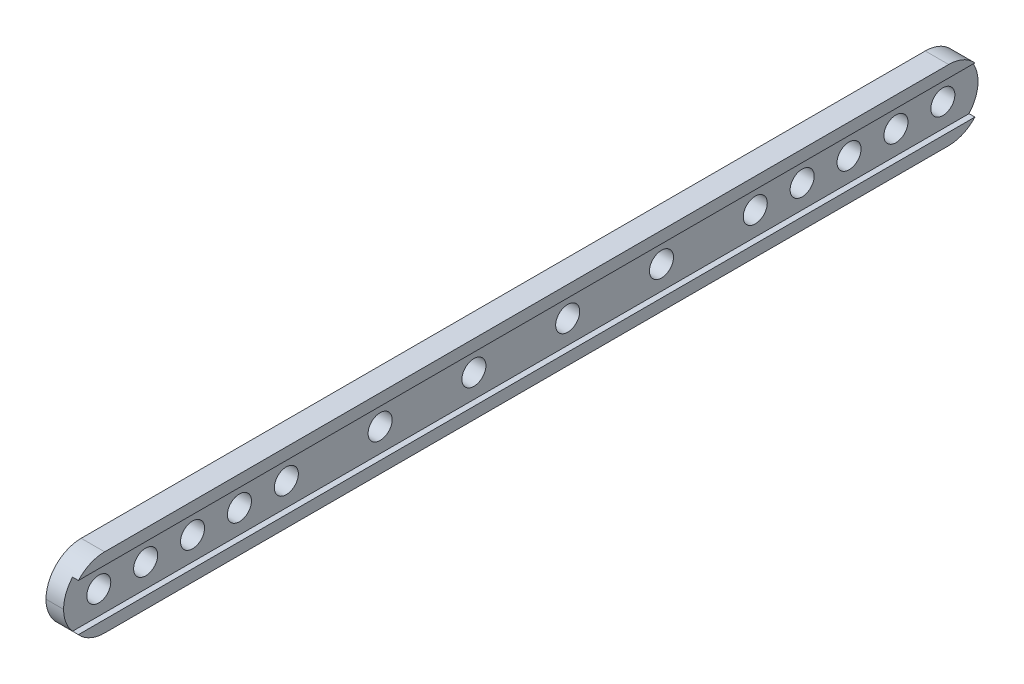
ISO-10303-21;
HEADER;
FILE_DESCRIPTION(('STEP AP214'),'2;1');
FILE_NAME('part.step','',(''),(''),'','','');
FILE_SCHEMA(('AUTOMOTIVE_DESIGN { 1 0 10303 214 1 1 1 1 }'));
ENDSEC;
DATA;
#1=APPLICATION_CONTEXT('core data for automotive mechanical design processes');
#2=APPLICATION_PROTOCOL_DEFINITION('international standard','automotive_design',2000,#1);
#3=PRODUCT_CONTEXT('',#1,'mechanical');
#4=PRODUCT('Part','Part','',(#3));
#5=PRODUCT_RELATED_PRODUCT_CATEGORY('part','',(#4));
#6=PRODUCT_DEFINITION_FORMATION('','',#4);
#7=PRODUCT_DEFINITION_CONTEXT('part definition',#1,'design');
#8=PRODUCT_DEFINITION('design','',#6,#7);
#9=PRODUCT_DEFINITION_SHAPE('','',#8);
#10=(LENGTH_UNIT() NAMED_UNIT(*) SI_UNIT(.MILLI.,.METRE.));
#11=(NAMED_UNIT(*) PLANE_ANGLE_UNIT() SI_UNIT($,.RADIAN.));
#12=(NAMED_UNIT(*) SI_UNIT($,.STERADIAN.) SOLID_ANGLE_UNIT());
#13=UNCERTAINTY_MEASURE_WITH_UNIT(LENGTH_MEASURE(1.E-05),#10,'distance_accuracy_value','');
#14=(GEOMETRIC_REPRESENTATION_CONTEXT(3) GLOBAL_UNCERTAINTY_ASSIGNED_CONTEXT((#13)) GLOBAL_UNIT_ASSIGNED_CONTEXT((#10,
#11,#12)) REPRESENTATION_CONTEXT('',''));
#15=CARTESIAN_POINT('',(0.,0.,0.));
#16=DIRECTION('',(0.,0.,1.));
#17=DIRECTION('',(1.,0.,0.));
#18=AXIS2_PLACEMENT_3D('',#15,#16,#17);
#19=CARTESIAN_POINT('',(4.,6.,-86.));
#20=DIRECTION('',(-1.,0.,0.));
#21=DIRECTION('',(0.,-1.,0.));
#22=AXIS2_PLACEMENT_3D('',#19,#20,#21);
#23=CYLINDRICAL_SURFACE('',#22,2.04999999999999);
#24=CARTESIAN_POINT('',(3.,6.,-86.));
#25=DIRECTION('',(1.,0.,0.));
#26=DIRECTION('',(0.,1.,0.));
#27=AXIS2_PLACEMENT_3D('',#24,#25,#26);
#28=CIRCLE('',#27,2.04999999999999);
#29=CARTESIAN_POINT('',(3.,8.04999999999999,-86.));
#30=VERTEX_POINT('',#29);
#31=EDGE_CURVE('E41',#30,#30,#28,.T.);
#32=ORIENTED_EDGE('',*,*,#31,.T.);
#33=EDGE_LOOP('',(#32));
#34=FACE_BOUND('',#33,.T.);
#35=CARTESIAN_POINT('',(0.,6.,-86.));
#36=DIRECTION('',(-1.,0.,0.));
#37=DIRECTION('',(0.,-1.,0.));
#38=AXIS2_PLACEMENT_3D('',#35,#36,#37);
#39=CIRCLE('',#38,2.04999999999999);
#40=CARTESIAN_POINT('',(0.,3.95000000000001,-86.));
#41=VERTEX_POINT('',#40);
#42=EDGE_CURVE('E11',#41,#41,#39,.T.);
#43=ORIENTED_EDGE('',*,*,#42,.T.);
#44=EDGE_LOOP('',(#43));
#45=FACE_BOUND('',#44,.T.);
#46=ADVANCED_FACE('F33',(#34,#45),#23,.F.);
#47=CARTESIAN_POINT('',(4.,6.,-102.));
#48=DIRECTION('',(-1.,0.,0.));
#49=DIRECTION('',(0.,-1.,0.));
#50=AXIS2_PLACEMENT_3D('',#47,#48,#49);
#51=CYLINDRICAL_SURFACE('',#50,2.04999999999999);
#52=CARTESIAN_POINT('',(3.,6.,-102.));
#53=DIRECTION('',(1.,0.,0.));
#54=DIRECTION('',(0.,1.,0.));
#55=AXIS2_PLACEMENT_3D('',#52,#53,#54);
#56=CIRCLE('',#55,2.04999999999999);
#57=CARTESIAN_POINT('',(3.,8.04999999999999,-102.));
#58=VERTEX_POINT('',#57);
#59=EDGE_CURVE('E197',#58,#58,#56,.T.);
#60=ORIENTED_EDGE('',*,*,#59,.T.);
#61=EDGE_LOOP('',(#60));
#62=FACE_BOUND('',#61,.T.);
#63=CARTESIAN_POINT('',(0.,6.,-102.));
#64=DIRECTION('',(-1.,0.,0.));
#65=DIRECTION('',(0.,-1.,0.));
#66=AXIS2_PLACEMENT_3D('',#63,#64,#65);
#67=CIRCLE('',#66,2.04999999999999);
#68=CARTESIAN_POINT('',(0.,3.95000000000001,-102.));
#69=VERTEX_POINT('',#68);
#70=EDGE_CURVE('E200',#69,#69,#67,.T.);
#71=ORIENTED_EDGE('',*,*,#70,.T.);
#72=EDGE_LOOP('',(#71));
#73=FACE_BOUND('',#72,.T.);
#74=ADVANCED_FACE('F288',(#62,#73),#51,.F.);
#75=CARTESIAN_POINT('',(4.,6.,-118.));
#76=DIRECTION('',(-1.,0.,0.));
#77=DIRECTION('',(0.,-1.,0.));
#78=AXIS2_PLACEMENT_3D('',#75,#76,#77);
#79=CYLINDRICAL_SURFACE('',#78,2.04999999999999);
#80=CARTESIAN_POINT('',(3.,6.,-118.));
#81=DIRECTION('',(1.,0.,0.));
#82=DIRECTION('',(0.,1.,0.));
#83=AXIS2_PLACEMENT_3D('',#80,#81,#82);
#84=CIRCLE('',#83,2.04999999999999);
#85=CARTESIAN_POINT('',(3.,8.04999999999999,-118.));
#86=VERTEX_POINT('',#85);
#87=EDGE_CURVE('E191',#86,#86,#84,.T.);
#88=ORIENTED_EDGE('',*,*,#87,.T.);
#89=EDGE_LOOP('',(#88));
#90=FACE_BOUND('',#89,.T.);
#91=CARTESIAN_POINT('',(0.,6.,-118.));
#92=DIRECTION('',(-1.,0.,0.));
#93=DIRECTION('',(0.,-1.,0.));
#94=AXIS2_PLACEMENT_3D('',#91,#92,#93);
#95=CIRCLE('',#94,2.04999999999999);
#96=CARTESIAN_POINT('',(0.,3.95000000000001,-118.));
#97=VERTEX_POINT('',#96);
#98=EDGE_CURVE('E194',#97,#97,#95,.T.);
#99=ORIENTED_EDGE('',*,*,#98,.T.);
#100=EDGE_LOOP('',(#99));
#101=FACE_BOUND('',#100,.T.);
#102=ADVANCED_FACE('F293',(#90,#101),#79,.F.);
#103=CARTESIAN_POINT('',(4.,6.,-126.));
#104=DIRECTION('',(-1.,0.,0.));
#105=DIRECTION('',(0.,-1.,0.));
#106=AXIS2_PLACEMENT_3D('',#103,#104,#105);
#107=CYLINDRICAL_SURFACE('',#106,2.04999999999999);
#108=CARTESIAN_POINT('',(3.,6.,-126.));
#109=DIRECTION('',(1.,0.,0.));
#110=DIRECTION('',(0.,1.,0.));
#111=AXIS2_PLACEMENT_3D('',#108,#109,#110);
#112=CIRCLE('',#111,2.04999999999999);
#113=CARTESIAN_POINT('',(3.,8.04999999999999,-126.));
#114=VERTEX_POINT('',#113);
#115=EDGE_CURVE('E185',#114,#114,#112,.T.);
#116=ORIENTED_EDGE('',*,*,#115,.T.);
#117=EDGE_LOOP('',(#116));
#118=FACE_BOUND('',#117,.T.);
#119=CARTESIAN_POINT('',(0.,6.,-126.));
#120=DIRECTION('',(-1.,0.,0.));
#121=DIRECTION('',(0.,-1.,0.));
#122=AXIS2_PLACEMENT_3D('',#119,#120,#121);
#123=CIRCLE('',#122,2.04999999999999);
#124=CARTESIAN_POINT('',(0.,3.95000000000001,-126.));
#125=VERTEX_POINT('',#124);
#126=EDGE_CURVE('E188',#125,#125,#123,.T.);
#127=ORIENTED_EDGE('',*,*,#126,.T.);
#128=EDGE_LOOP('',(#127));
#129=FACE_BOUND('',#128,.T.);
#130=ADVANCED_FACE('F311',(#118,#129),#107,.F.);
#131=CARTESIAN_POINT('',(4.,6.,-134.));
#132=DIRECTION('',(-1.,0.,0.));
#133=DIRECTION('',(0.,-1.,0.));
#134=AXIS2_PLACEMENT_3D('',#131,#132,#133);
#135=CYLINDRICAL_SURFACE('',#134,2.04999999999999);
#136=CARTESIAN_POINT('',(3.,6.,-134.));
#137=DIRECTION('',(1.,0.,0.));
#138=DIRECTION('',(0.,1.,0.));
#139=AXIS2_PLACEMENT_3D('',#136,#137,#138);
#140=CIRCLE('',#139,2.04999999999999);
#141=CARTESIAN_POINT('',(3.,8.04999999999999,-134.));
#142=VERTEX_POINT('',#141);
#143=EDGE_CURVE('E172',#142,#142,#140,.T.);
#144=ORIENTED_EDGE('',*,*,#143,.T.);
#145=EDGE_LOOP('',(#144));
#146=FACE_BOUND('',#145,.T.);
#147=CARTESIAN_POINT('',(0.,6.,-134.));
#148=DIRECTION('',(-1.,0.,0.));
#149=DIRECTION('',(0.,-1.,0.));
#150=AXIS2_PLACEMENT_3D('',#147,#148,#149);
#151=CIRCLE('',#150,2.04999999999999);
#152=CARTESIAN_POINT('',(0.,3.95000000000001,-134.));
#153=VERTEX_POINT('',#152);
#154=EDGE_CURVE('E182',#153,#153,#151,.T.);
#155=ORIENTED_EDGE('',*,*,#154,.T.);
#156=EDGE_LOOP('',(#155));
#157=FACE_BOUND('',#156,.T.);
#158=ADVANCED_FACE('F301',(#146,#157),#135,.F.);
#159=CARTESIAN_POINT('',(0.,0.,-156.));
#160=DIRECTION('',(-1.,0.,0.));
#161=DIRECTION('',(0.,-1.,0.));
#162=AXIS2_PLACEMENT_3D('',#159,#160,#161);
#163=PLANE('',#162);
#164=CARTESIAN_POINT('',(0.,6.,-22.));
#165=DIRECTION('',(1.,0.,0.));
#166=DIRECTION('',(0.,-1.,0.));
#167=AXIS2_PLACEMENT_3D('',#164,#165,#166);
#168=CIRCLE('',#167,2.04999999999999);
#169=CARTESIAN_POINT('',(0.,3.95000000000001,-22.));
#170=VERTEX_POINT('',#169);
#171=EDGE_CURVE('E218',#170,#170,#168,.T.);
#172=ORIENTED_EDGE('',*,*,#171,.T.);
#173=EDGE_LOOP('',(#172));
#174=FACE_BOUND('',#173,.T.);
#175=CARTESIAN_POINT('',(0.,6.,-30.));
#176=DIRECTION('',(1.,0.,0.));
#177=DIRECTION('',(0.,-1.,0.));
#178=AXIS2_PLACEMENT_3D('',#175,#176,#177);
#179=CIRCLE('',#178,2.04999999999999);
#180=CARTESIAN_POINT('',(0.,3.95000000000001,-30.));
#181=VERTEX_POINT('',#180);
#182=EDGE_CURVE('E379',#181,#181,#179,.T.);
#183=ORIENTED_EDGE('',*,*,#182,.T.);
#184=EDGE_LOOP('',(#183));
#185=FACE_BOUND('',#184,.T.);
#186=CARTESIAN_POINT('',(0.,6.,-38.));
#187=DIRECTION('',(1.,0.,0.));
#188=DIRECTION('',(0.,-1.,0.));
#189=AXIS2_PLACEMENT_3D('',#186,#187,#188);
#190=CIRCLE('',#189,2.04999999999999);
#191=CARTESIAN_POINT('',(0.,3.95000000000001,-38.));
#192=VERTEX_POINT('',#191);
#193=EDGE_CURVE('E382',#192,#192,#190,.T.);
#194=ORIENTED_EDGE('',*,*,#193,.T.);
#195=EDGE_LOOP('',(#194));
#196=FACE_BOUND('',#195,.T.);
#197=CARTESIAN_POINT('',(0.,6.,-54.));
#198=DIRECTION('',(1.,0.,0.));
#199=DIRECTION('',(0.,-1.,0.));
#200=AXIS2_PLACEMENT_3D('',#197,#198,#199);
#201=CIRCLE('',#200,2.04999999999999);
#202=CARTESIAN_POINT('',(0.,3.95000000000001,-54.));
#203=VERTEX_POINT('',#202);
#204=EDGE_CURVE('E386',#203,#203,#201,.T.);
#205=ORIENTED_EDGE('',*,*,#204,.T.);
#206=EDGE_LOOP('',(#205));
#207=FACE_BOUND('',#206,.T.);
#208=CARTESIAN_POINT('',(0.,6.,-70.));
#209=DIRECTION('',(1.,0.,0.));
#210=DIRECTION('',(0.,-1.,0.));
#211=AXIS2_PLACEMENT_3D('',#208,#209,#210);
#212=CIRCLE('',#211,2.04999999999999);
#213=CARTESIAN_POINT('',(0.,3.95000000000001,-70.));
#214=VERTEX_POINT('',#213);
#215=EDGE_CURVE('E236',#214,#214,#212,.T.);
#216=ORIENTED_EDGE('',*,*,#215,.T.);
#217=EDGE_LOOP('',(#216));
#218=FACE_BOUND('',#217,.T.);
#219=CARTESIAN_POINT('',(0.,6.,-14.));
#220=DIRECTION('',(1.,0.,0.));
#221=DIRECTION('',(0.,-1.,0.));
#222=AXIS2_PLACEMENT_3D('',#219,#220,#221);
#223=CIRCLE('',#222,2.04999999999999);
#224=CARTESIAN_POINT('',(0.,3.95000000000001,-14.));
#225=VERTEX_POINT('',#224);
#226=EDGE_CURVE('E213',#225,#225,#223,.T.);
#227=ORIENTED_EDGE('',*,*,#226,.T.);
#228=EDGE_LOOP('',(#227));
#229=FACE_BOUND('',#228,.T.);
#230=CARTESIAN_POINT('',(0.,6.,-6.00000000000001));
#231=DIRECTION('',(1.,0.,0.));
#232=DIRECTION('',(0.,-1.,0.));
#233=AXIS2_PLACEMENT_3D('',#230,#231,#232);
#234=CIRCLE('',#233,2.04999999999999);
#235=CARTESIAN_POINT('',(0.,3.95000000000001,-6.00000000000001));
#236=VERTEX_POINT('',#235);
#237=EDGE_CURVE('E209',#236,#236,#234,.T.);
#238=ORIENTED_EDGE('',*,*,#237,.T.);
#239=EDGE_LOOP('',(#238));
#240=FACE_BOUND('',#239,.T.);
#241=CARTESIAN_POINT('',(0.,6.,-142.));
#242=DIRECTION('',(-1.,0.,0.));
#243=DIRECTION('',(0.,-1.,0.));
#244=AXIS2_PLACEMENT_3D('',#241,#242,#243);
#245=CIRCLE('',#244,2.04999999999999);
#246=CARTESIAN_POINT('',(0.,3.95000000000001,-142.));
#247=VERTEX_POINT('',#246);
#248=EDGE_CURVE('E242',#247,#247,#245,.T.);
#249=ORIENTED_EDGE('',*,*,#248,.F.);
#250=EDGE_LOOP('',(#249));
#251=FACE_BOUND('',#250,.T.);
#252=CARTESIAN_POINT('',(0.,6.,-150.));
#253=DIRECTION('',(-1.,0.,0.));
#254=DIRECTION('',(0.,-1.,0.));
#255=AXIS2_PLACEMENT_3D('',#252,#253,#254);
#256=CIRCLE('',#255,2.04999999999999);
#257=CARTESIAN_POINT('',(0.,3.95000000000001,-150.));
#258=VERTEX_POINT('',#257);
#259=EDGE_CURVE('E179',#258,#258,#256,.T.);
#260=ORIENTED_EDGE('',*,*,#259,.F.);
#261=EDGE_LOOP('',(#260));
#262=FACE_BOUND('',#261,.T.);
#263=CARTESIAN_POINT('',(0.,6.,-6.));
#264=DIRECTION('',(-1.,0.,0.));
#265=DIRECTION('',(0.,-1.,0.));
#266=AXIS2_PLACEMENT_3D('',#263,#264,#265);
#267=CIRCLE('',#266,6.);
#268=CARTESIAN_POINT('',(0.,0.,-6.00000000000001));
#269=VERTEX_POINT('',#268);
#270=CARTESIAN_POINT('',(0.,6.,0.));
#271=VERTEX_POINT('',#270);
#272=EDGE_CURVE('E114',#269,#271,#267,.T.);
#273=ORIENTED_EDGE('',*,*,#272,.T.);
#274=CARTESIAN_POINT('',(0.,6.,-6.));
#275=DIRECTION('',(-1.,0.,0.));
#276=DIRECTION('',(0.,-1.,0.));
#277=AXIS2_PLACEMENT_3D('',#274,#275,#276);
#278=CIRCLE('',#277,6.);
#279=CARTESIAN_POINT('',(0.,12.,-6.00000000000001));
#280=VERTEX_POINT('',#279);
#281=EDGE_CURVE('E120',#271,#280,#278,.T.);
#282=ORIENTED_EDGE('',*,*,#281,.T.);
#283=DIRECTION('',(0.,0.,1.));
#284=VECTOR('',#283,1.);
#285=CARTESIAN_POINT('',(0.,12.,-156.));
#286=LINE('',#285,#284);
#287=CARTESIAN_POINT('',(0.,12.,-150.));
#288=VERTEX_POINT('',#287);
#289=EDGE_CURVE('E247',#288,#280,#286,.T.);
#290=ORIENTED_EDGE('',*,*,#289,.F.);
#291=CARTESIAN_POINT('',(0.,6.,-150.));
#292=DIRECTION('',(-1.,0.,0.));
#293=DIRECTION('',(0.,-1.,0.));
#294=AXIS2_PLACEMENT_3D('',#291,#292,#293);
#295=CIRCLE('',#294,6.);
#296=CARTESIAN_POINT('',(0.,6.,-156.));
#297=VERTEX_POINT('',#296);
#298=EDGE_CURVE('E249',#288,#297,#295,.T.);
#299=ORIENTED_EDGE('',*,*,#298,.T.);
#300=CARTESIAN_POINT('',(0.,6.,-150.));
#301=DIRECTION('',(-1.,0.,0.));
#302=DIRECTION('',(0.,-1.,0.));
#303=AXIS2_PLACEMENT_3D('',#300,#301,#302);
#304=CIRCLE('',#303,6.);
#305=CARTESIAN_POINT('',(0.,0.,-150.));
#306=VERTEX_POINT('',#305);
#307=EDGE_CURVE('E126',#297,#306,#304,.T.);
#308=ORIENTED_EDGE('',*,*,#307,.T.);
#309=DIRECTION('',(0.,0.,1.));
#310=VECTOR('',#309,1.);
#311=CARTESIAN_POINT('',(0.,0.,-156.));
#312=LINE('',#311,#310);
#313=EDGE_CURVE('E123',#306,#269,#312,.T.);
#314=ORIENTED_EDGE('',*,*,#313,.T.);
#315=EDGE_LOOP('',(#273,#282,#290,#299,#308,#314));
#316=FACE_BOUND('',#315,.T.);
#317=ORIENTED_EDGE('',*,*,#154,.F.);
#318=EDGE_LOOP('',(#317));
#319=FACE_BOUND('',#318,.T.);
#320=ORIENTED_EDGE('',*,*,#126,.F.);
#321=EDGE_LOOP('',(#320));
#322=FACE_BOUND('',#321,.T.);
#323=ORIENTED_EDGE('',*,*,#98,.F.);
#324=EDGE_LOOP('',(#323));
#325=FACE_BOUND('',#324,.T.);
#326=ORIENTED_EDGE('',*,*,#70,.F.);
#327=EDGE_LOOP('',(#326));
#328=FACE_BOUND('',#327,.T.);
#329=ORIENTED_EDGE('',*,*,#42,.F.);
#330=EDGE_LOOP('',(#329));
#331=FACE_BOUND('',#330,.T.);
#332=ADVANCED_FACE('F116',(#174,#185,#196,#207,#218,#229,#240,#251,#262,#316,#319,#322,#325,
#328,#331),#163,.T.);
#333=CARTESIAN_POINT('',(0.,12.,-156.));
#334=DIRECTION('',(0.,1.,0.));
#335=DIRECTION('',(0.,0.,1.));
#336=AXIS2_PLACEMENT_3D('',#333,#334,#335);
#337=PLANE('',#336);
#338=ORIENTED_EDGE('',*,*,#289,.T.);
#339=DIRECTION('',(-1.,0.,0.));
#340=VECTOR('',#339,1.);
#341=CARTESIAN_POINT('',(4.,12.,-6.));
#342=LINE('',#341,#340);
#343=CARTESIAN_POINT('',(4.,12.,-6.00000000000001));
#344=VERTEX_POINT('',#343);
#345=EDGE_CURVE('E141',#280,#344,#342,.F.);
#346=ORIENTED_EDGE('',*,*,#345,.T.);
#347=DIRECTION('',(0.,0.,1.));
#348=VECTOR('',#347,1.);
#349=CARTESIAN_POINT('',(4.,12.,-156.));
#350=LINE('',#349,#348);
#351=CARTESIAN_POINT('',(4.,12.,-150.));
#352=VERTEX_POINT('',#351);
#353=EDGE_CURVE('E250',#352,#344,#350,.T.);
#354=ORIENTED_EDGE('',*,*,#353,.F.);
#355=DIRECTION('',(-1.,0.,0.));
#356=VECTOR('',#355,1.);
#357=CARTESIAN_POINT('',(0.,12.,-150.));
#358=LINE('',#357,#356);
#359=EDGE_CURVE('E142',#352,#288,#358,.T.);
#360=ORIENTED_EDGE('',*,*,#359,.T.);
#361=EDGE_LOOP('',(#338,#346,#354,#360));
#362=FACE_BOUND('',#361,.T.);
#363=ADVANCED_FACE('F300',(#362),#337,.T.);
#364=CARTESIAN_POINT('',(4.,10.,-156.));
#365=DIRECTION('',(1.,0.,0.));
#366=DIRECTION('',(0.,1.,0.));
#367=AXIS2_PLACEMENT_3D('',#364,#365,#366);
#368=PLANE('',#367);
#369=ORIENTED_EDGE('',*,*,#353,.T.);
#370=CARTESIAN_POINT('',(4.,6.,-6.));
#371=DIRECTION('',(1.,0.,0.));
#372=DIRECTION('',(0.,1.,0.));
#373=AXIS2_PLACEMENT_3D('',#370,#371,#372);
#374=CIRCLE('',#373,6.);
#375=CARTESIAN_POINT('',(4.,10.,-1.52786404500044));
#376=VERTEX_POINT('',#375);
#377=EDGE_CURVE('E150',#344,#376,#374,.T.);
#378=ORIENTED_EDGE('',*,*,#377,.T.);
#379=DIRECTION('',(0.,0.,1.));
#380=VECTOR('',#379,1.);
#381=CARTESIAN_POINT('',(4.,10.,-156.));
#382=LINE('',#381,#380);
#383=CARTESIAN_POINT('',(4.,10.,-154.472135955));
#384=VERTEX_POINT('',#383);
#385=EDGE_CURVE('E253',#384,#376,#382,.T.);
#386=ORIENTED_EDGE('',*,*,#385,.F.);
#387=CARTESIAN_POINT('',(4.,6.,-150.));
#388=DIRECTION('',(1.,0.,0.));
#389=DIRECTION('',(0.,1.,0.));
#390=AXIS2_PLACEMENT_3D('',#387,#388,#389);
#391=CIRCLE('',#390,6.);
#392=EDGE_CURVE('E148',#384,#352,#391,.T.);
#393=ORIENTED_EDGE('',*,*,#392,.T.);
#394=EDGE_LOOP('',(#369,#378,#386,#393));
#395=FACE_BOUND('',#394,.T.);
#396=ADVANCED_FACE('F308',(#395),#368,.T.);
#397=CARTESIAN_POINT('',(4.,10.,-156.));
#398=DIRECTION('',(0.,-1.,0.));
#399=DIRECTION('',(1.,0.,0.));
#400=AXIS2_PLACEMENT_3D('',#397,#398,#399);
#401=PLANE('',#400);
#402=ORIENTED_EDGE('',*,*,#385,.T.);
#403=DIRECTION('',(1.,0.,0.));
#404=VECTOR('',#403,1.);
#405=CARTESIAN_POINT('',(4.,10.,-1.52786404500043));
#406=LINE('',#405,#404);
#407=CARTESIAN_POINT('',(3.,10.,-1.52786404500042));
#408=VERTEX_POINT('',#407);
#409=EDGE_CURVE('E154',#376,#408,#406,.F.);
#410=ORIENTED_EDGE('',*,*,#409,.T.);
#411=DIRECTION('',(0.,0.,1.));
#412=VECTOR('',#411,1.);
#413=CARTESIAN_POINT('',(3.,10.,-156.));
#414=LINE('',#413,#412);
#415=CARTESIAN_POINT('',(3.,10.,-154.472135955));
#416=VERTEX_POINT('',#415);
#417=EDGE_CURVE('E256',#416,#408,#414,.T.);
#418=ORIENTED_EDGE('',*,*,#417,.F.);
#419=DIRECTION('',(-1.,0.,0.));
#420=VECTOR('',#419,1.);
#421=CARTESIAN_POINT('',(3.,10.,-154.472135955));
#422=LINE('',#421,#420);
#423=EDGE_CURVE('E152',#416,#384,#422,.F.);
#424=ORIENTED_EDGE('',*,*,#423,.T.);
#425=EDGE_LOOP('',(#402,#410,#418,#424));
#426=FACE_BOUND('',#425,.T.);
#427=ADVANCED_FACE('F338',(#426),#401,.T.);
#428=CARTESIAN_POINT('',(3.,10.,-156.));
#429=DIRECTION('',(1.,0.,0.));
#430=DIRECTION('',(0.,1.,0.));
#431=AXIS2_PLACEMENT_3D('',#428,#429,#430);
#432=PLANE('',#431);
#433=CARTESIAN_POINT('',(3.,6.,-22.));
#434=DIRECTION('',(1.,0.,0.));
#435=DIRECTION('',(0.,1.,0.));
#436=AXIS2_PLACEMENT_3D('',#433,#434,#435);
#437=CIRCLE('',#436,2.04999999999999);
#438=CARTESIAN_POINT('',(3.,8.04999999999999,-22.));
#439=VERTEX_POINT('',#438);
#440=EDGE_CURVE('E36',#439,#439,#437,.F.);
#441=ORIENTED_EDGE('',*,*,#440,.T.);
#442=EDGE_LOOP('',(#441));
#443=FACE_BOUND('',#442,.T.);
#444=CARTESIAN_POINT('',(3.,6.,-30.));
#445=DIRECTION('',(1.,0.,0.));
#446=DIRECTION('',(0.,1.,0.));
#447=AXIS2_PLACEMENT_3D('',#444,#445,#446);
#448=CIRCLE('',#447,2.04999999999999);
#449=CARTESIAN_POINT('',(3.,8.04999999999999,-30.));
#450=VERTEX_POINT('',#449);
#451=EDGE_CURVE('E223',#450,#450,#448,.F.);
#452=ORIENTED_EDGE('',*,*,#451,.T.);
#453=EDGE_LOOP('',(#452));
#454=FACE_BOUND('',#453,.T.);
#455=CARTESIAN_POINT('',(3.,6.,-38.));
#456=DIRECTION('',(1.,0.,0.));
#457=DIRECTION('',(0.,1.,0.));
#458=AXIS2_PLACEMENT_3D('',#455,#456,#457);
#459=CIRCLE('',#458,2.04999999999999);
#460=CARTESIAN_POINT('',(3.,8.04999999999999,-38.));
#461=VERTEX_POINT('',#460);
#462=EDGE_CURVE('E221',#461,#461,#459,.F.);
#463=ORIENTED_EDGE('',*,*,#462,.T.);
#464=EDGE_LOOP('',(#463));
#465=FACE_BOUND('',#464,.T.);
#466=CARTESIAN_POINT('',(3.,6.,-54.));
#467=DIRECTION('',(1.,0.,0.));
#468=DIRECTION('',(0.,1.,0.));
#469=AXIS2_PLACEMENT_3D('',#466,#467,#468);
#470=CIRCLE('',#469,2.04999999999999);
#471=CARTESIAN_POINT('',(3.,8.04999999999999,-54.));
#472=VERTEX_POINT('',#471);
#473=EDGE_CURVE('E217',#472,#472,#470,.F.);
#474=ORIENTED_EDGE('',*,*,#473,.T.);
#475=EDGE_LOOP('',(#474));
#476=FACE_BOUND('',#475,.T.);
#477=CARTESIAN_POINT('',(3.,6.,-70.));
#478=DIRECTION('',(1.,0.,0.));
#479=DIRECTION('',(0.,1.,0.));
#480=AXIS2_PLACEMENT_3D('',#477,#478,#479);
#481=CIRCLE('',#480,2.04999999999999);
#482=CARTESIAN_POINT('',(3.,8.04999999999999,-70.));
#483=VERTEX_POINT('',#482);
#484=EDGE_CURVE('E214',#483,#483,#481,.F.);
#485=ORIENTED_EDGE('',*,*,#484,.T.);
#486=EDGE_LOOP('',(#485));
#487=FACE_BOUND('',#486,.T.);
#488=CARTESIAN_POINT('',(3.,6.,-14.));
#489=DIRECTION('',(1.,0.,0.));
#490=DIRECTION('',(0.,1.,0.));
#491=AXIS2_PLACEMENT_3D('',#488,#489,#490);
#492=CIRCLE('',#491,2.04999999999999);
#493=CARTESIAN_POINT('',(3.,8.04999999999999,-14.));
#494=VERTEX_POINT('',#493);
#495=EDGE_CURVE('E210',#494,#494,#492,.F.);
#496=ORIENTED_EDGE('',*,*,#495,.T.);
#497=EDGE_LOOP('',(#496));
#498=FACE_BOUND('',#497,.T.);
#499=CARTESIAN_POINT('',(3.,6.,-6.00000000000001));
#500=DIRECTION('',(1.,0.,0.));
#501=DIRECTION('',(0.,1.,0.));
#502=AXIS2_PLACEMENT_3D('',#499,#500,#501);
#503=CIRCLE('',#502,2.04999999999999);
#504=CARTESIAN_POINT('',(3.,8.04999999999999,-6.00000000000001));
#505=VERTEX_POINT('',#504);
#506=EDGE_CURVE('E205',#505,#505,#503,.F.);
#507=ORIENTED_EDGE('',*,*,#506,.T.);
#508=EDGE_LOOP('',(#507));
#509=FACE_BOUND('',#508,.T.);
#510=CARTESIAN_POINT('',(3.,6.,-142.));
#511=DIRECTION('',(1.,0.,0.));
#512=DIRECTION('',(0.,1.,0.));
#513=AXIS2_PLACEMENT_3D('',#510,#511,#512);
#514=CIRCLE('',#513,2.04999999999999);
#515=CARTESIAN_POINT('',(3.,8.04999999999999,-142.));
#516=VERTEX_POINT('',#515);
#517=EDGE_CURVE('E208',#516,#516,#514,.T.);
#518=ORIENTED_EDGE('',*,*,#517,.F.);
#519=EDGE_LOOP('',(#518));
#520=FACE_BOUND('',#519,.T.);
#521=CARTESIAN_POINT('',(3.,6.,-150.));
#522=DIRECTION('',(1.,0.,0.));
#523=DIRECTION('',(0.,1.,0.));
#524=AXIS2_PLACEMENT_3D('',#521,#522,#523);
#525=CIRCLE('',#524,2.04999999999999);
#526=CARTESIAN_POINT('',(3.,8.04999999999999,-150.));
#527=VERTEX_POINT('',#526);
#528=EDGE_CURVE('E176',#527,#527,#525,.T.);
#529=ORIENTED_EDGE('',*,*,#528,.F.);
#530=EDGE_LOOP('',(#529));
#531=FACE_BOUND('',#530,.T.);
#532=ORIENTED_EDGE('',*,*,#417,.T.);
#533=CARTESIAN_POINT('',(3.,6.,-6.));
#534=DIRECTION('',(1.,0.,0.));
#535=DIRECTION('',(0.,1.,0.));
#536=AXIS2_PLACEMENT_3D('',#533,#534,#535);
#537=CIRCLE('',#536,6.);
#538=CARTESIAN_POINT('',(3.,6.,0.));
#539=VERTEX_POINT('',#538);
#540=EDGE_CURVE('E161',#408,#539,#537,.T.);
#541=ORIENTED_EDGE('',*,*,#540,.T.);
#542=CARTESIAN_POINT('',(3.,6.,-6.));
#543=DIRECTION('',(1.,0.,0.));
#544=DIRECTION('',(0.,1.,0.));
#545=AXIS2_PLACEMENT_3D('',#542,#543,#544);
#546=CIRCLE('',#545,6.);
#547=CARTESIAN_POINT('',(3.,2.,-1.52786404500044));
#548=VERTEX_POINT('',#547);
#549=EDGE_CURVE('E133',#539,#548,#546,.T.);
#550=ORIENTED_EDGE('',*,*,#549,.T.);
#551=DIRECTION('',(0.,0.,1.));
#552=VECTOR('',#551,1.);
#553=CARTESIAN_POINT('',(3.,2.,-156.));
#554=LINE('',#553,#552);
#555=CARTESIAN_POINT('',(3.,2.,-154.472135955));
#556=VERTEX_POINT('',#555);
#557=EDGE_CURVE('E259',#556,#548,#554,.T.);
#558=ORIENTED_EDGE('',*,*,#557,.F.);
#559=CARTESIAN_POINT('',(3.,6.,-150.));
#560=DIRECTION('',(1.,0.,0.));
#561=DIRECTION('',(0.,1.,0.));
#562=AXIS2_PLACEMENT_3D('',#559,#560,#561);
#563=CIRCLE('',#562,6.);
#564=CARTESIAN_POINT('',(3.,6.,-156.));
#565=VERTEX_POINT('',#564);
#566=EDGE_CURVE('E158',#556,#565,#563,.T.);
#567=ORIENTED_EDGE('',*,*,#566,.T.);
#568=CARTESIAN_POINT('',(3.,6.,-150.));
#569=DIRECTION('',(1.,0.,0.));
#570=DIRECTION('',(0.,1.,0.));
#571=AXIS2_PLACEMENT_3D('',#568,#569,#570);
#572=CIRCLE('',#571,6.);
#573=EDGE_CURVE('E156',#565,#416,#572,.T.);
#574=ORIENTED_EDGE('',*,*,#573,.T.);
#575=EDGE_LOOP('',(#532,#541,#550,#558,#567,#574));
#576=FACE_BOUND('',#575,.T.);
#577=ORIENTED_EDGE('',*,*,#143,.F.);
#578=EDGE_LOOP('',(#577));
#579=FACE_BOUND('',#578,.T.);
#580=ORIENTED_EDGE('',*,*,#115,.F.);
#581=EDGE_LOOP('',(#580));
#582=FACE_BOUND('',#581,.T.);
#583=ORIENTED_EDGE('',*,*,#87,.F.);
#584=EDGE_LOOP('',(#583));
#585=FACE_BOUND('',#584,.T.);
#586=ORIENTED_EDGE('',*,*,#59,.F.);
#587=EDGE_LOOP('',(#586));
#588=FACE_BOUND('',#587,.T.);
#589=ORIENTED_EDGE('',*,*,#31,.F.);
#590=EDGE_LOOP('',(#589));
#591=FACE_BOUND('',#590,.T.);
#592=ADVANCED_FACE('F332',(#443,#454,#465,#476,#487,#498,#509,#520,#531,#576,#579,#582,#585,
#588,#591),#432,.T.);
#593=CARTESIAN_POINT('',(4.,2.,-156.));
#594=DIRECTION('',(0.,1.,0.));
#595=DIRECTION('',(-1.,0.,0.));
#596=AXIS2_PLACEMENT_3D('',#593,#594,#595);
#597=PLANE('',#596);
#598=ORIENTED_EDGE('',*,*,#557,.T.);
#599=DIRECTION('',(-1.,0.,0.));
#600=VECTOR('',#599,1.);
#601=CARTESIAN_POINT('',(3.,2.,-1.52786404500043));
#602=LINE('',#601,#600);
#603=CARTESIAN_POINT('',(4.,2.,-1.52786404500042));
#604=VERTEX_POINT('',#603);
#605=EDGE_CURVE('E165',#548,#604,#602,.F.);
#606=ORIENTED_EDGE('',*,*,#605,.T.);
#607=DIRECTION('',(0.,0.,1.));
#608=VECTOR('',#607,1.);
#609=CARTESIAN_POINT('',(4.,2.,-156.));
#610=LINE('',#609,#608);
#611=CARTESIAN_POINT('',(4.,2.,-154.472135955));
#612=VERTEX_POINT('',#611);
#613=EDGE_CURVE('E262',#612,#604,#610,.T.);
#614=ORIENTED_EDGE('',*,*,#613,.F.);
#615=DIRECTION('',(1.,0.,0.));
#616=VECTOR('',#615,1.);
#617=CARTESIAN_POINT('',(4.,2.,-154.472135955));
#618=LINE('',#617,#616);
#619=EDGE_CURVE('E163',#612,#556,#618,.F.);
#620=ORIENTED_EDGE('',*,*,#619,.T.);
#621=EDGE_LOOP('',(#598,#606,#614,#620));
#622=FACE_BOUND('',#621,.T.);
#623=ADVANCED_FACE('F328',(#622),#597,.T.);
#624=CARTESIAN_POINT('',(4.,0.,-156.));
#625=DIRECTION('',(1.,0.,0.));
#626=DIRECTION('',(0.,1.,0.));
#627=AXIS2_PLACEMENT_3D('',#624,#625,#626);
#628=PLANE('',#627);
#629=ORIENTED_EDGE('',*,*,#613,.T.);
#630=CARTESIAN_POINT('',(4.,6.,-6.));
#631=DIRECTION('',(1.,0.,0.));
#632=DIRECTION('',(0.,1.,0.));
#633=AXIS2_PLACEMENT_3D('',#630,#631,#632);
#634=CIRCLE('',#633,6.);
#635=CARTESIAN_POINT('',(4.,0.,-6.00000000000001));
#636=VERTEX_POINT('',#635);
#637=EDGE_CURVE('E49',#604,#636,#634,.T.);
#638=ORIENTED_EDGE('',*,*,#637,.T.);
#639=DIRECTION('',(0.,0.,1.));
#640=VECTOR('',#639,1.);
#641=CARTESIAN_POINT('',(4.,0.,-156.));
#642=LINE('',#641,#640);
#643=CARTESIAN_POINT('',(4.,0.,-150.));
#644=VERTEX_POINT('',#643);
#645=EDGE_CURVE('E264',#644,#636,#642,.T.);
#646=ORIENTED_EDGE('',*,*,#645,.F.);
#647=CARTESIAN_POINT('',(4.,6.,-150.));
#648=DIRECTION('',(1.,0.,0.));
#649=DIRECTION('',(0.,1.,0.));
#650=AXIS2_PLACEMENT_3D('',#647,#648,#649);
#651=CIRCLE('',#650,6.);
#652=EDGE_CURVE('E57',#644,#612,#651,.T.);
#653=ORIENTED_EDGE('',*,*,#652,.T.);
#654=EDGE_LOOP('',(#629,#638,#646,#653));
#655=FACE_BOUND('',#654,.T.);
#656=ADVANCED_FACE('F324',(#655),#628,.T.);
#657=CARTESIAN_POINT('',(0.,0.,-156.));
#658=DIRECTION('',(0.,-1.,0.));
#659=DIRECTION('',(0.,0.,-1.));
#660=AXIS2_PLACEMENT_3D('',#657,#658,#659);
#661=PLANE('',#660);
#662=ORIENTED_EDGE('',*,*,#645,.T.);
#663=DIRECTION('',(1.,0.,0.));
#664=VECTOR('',#663,1.);
#665=CARTESIAN_POINT('',(0.,0.,-6.));
#666=LINE('',#665,#664);
#667=EDGE_CURVE('E171',#636,#269,#666,.F.);
#668=ORIENTED_EDGE('',*,*,#667,.T.);
#669=ORIENTED_EDGE('',*,*,#313,.F.);
#670=DIRECTION('',(1.,0.,0.));
#671=VECTOR('',#670,1.);
#672=CARTESIAN_POINT('',(0.,0.,-150.));
#673=LINE('',#672,#671);
#674=EDGE_CURVE('E169',#306,#644,#673,.T.);
#675=ORIENTED_EDGE('',*,*,#674,.T.);
#676=EDGE_LOOP('',(#662,#668,#669,#675));
#677=FACE_BOUND('',#676,.T.);
#678=ADVANCED_FACE('F271',(#677),#661,.T.);
#679=CARTESIAN_POINT('',(0.,6.,-6.));
#680=DIRECTION('',(-1.,0.,0.));
#681=DIRECTION('',(0.,0.,1.));
#682=AXIS2_PLACEMENT_3D('',#679,#680,#681);
#683=CYLINDRICAL_SURFACE('',#682,6.);
#684=ORIENTED_EDGE('',*,*,#605,.F.);
#685=ORIENTED_EDGE('',*,*,#549,.F.);
#686=DIRECTION('',(1.,0.,0.));
#687=VECTOR('',#686,1.);
#688=CARTESIAN_POINT('',(4.,6.,0.));
#689=LINE('',#688,#687);
#690=EDGE_CURVE('E130',#271,#539,#689,.T.);
#691=ORIENTED_EDGE('',*,*,#690,.F.);
#692=ORIENTED_EDGE('',*,*,#272,.F.);
#693=ORIENTED_EDGE('',*,*,#667,.F.);
#694=ORIENTED_EDGE('',*,*,#637,.F.);
#695=EDGE_LOOP('',(#684,#685,#691,#692,#693,#694));
#696=FACE_BOUND('',#695,.T.);
#697=ADVANCED_FACE('F132',(#696),#683,.T.);
#698=CARTESIAN_POINT('',(0.,6.,-6.));
#699=DIRECTION('',(1.,0.,0.));
#700=DIRECTION('',(0.,0.,-1.));
#701=AXIS2_PLACEMENT_3D('',#698,#699,#700);
#702=CYLINDRICAL_SURFACE('',#701,6.);
#703=ORIENTED_EDGE('',*,*,#377,.F.);
#704=ORIENTED_EDGE('',*,*,#345,.F.);
#705=ORIENTED_EDGE('',*,*,#281,.F.);
#706=ORIENTED_EDGE('',*,*,#690,.T.);
#707=ORIENTED_EDGE('',*,*,#540,.F.);
#708=ORIENTED_EDGE('',*,*,#409,.F.);
#709=EDGE_LOOP('',(#703,#704,#705,#706,#707,#708));
#710=FACE_BOUND('',#709,.T.);
#711=ADVANCED_FACE('F139',(#710),#702,.T.);
#712=CARTESIAN_POINT('',(0.,6.,-150.));
#713=DIRECTION('',(-1.,0.,0.));
#714=DIRECTION('',(0.,0.,1.));
#715=AXIS2_PLACEMENT_3D('',#712,#713,#714);
#716=CYLINDRICAL_SURFACE('',#715,6.);
#717=DIRECTION('',(-1.,0.,0.));
#718=VECTOR('',#717,1.);
#719=CARTESIAN_POINT('',(0.,6.,-156.));
#720=LINE('',#719,#718);
#721=EDGE_CURVE('E136',#297,#565,#720,.F.);
#722=ORIENTED_EDGE('',*,*,#721,.F.);
#723=ORIENTED_EDGE('',*,*,#298,.F.);
#724=ORIENTED_EDGE('',*,*,#359,.F.);
#725=ORIENTED_EDGE('',*,*,#392,.F.);
#726=ORIENTED_EDGE('',*,*,#423,.F.);
#727=ORIENTED_EDGE('',*,*,#573,.F.);
#728=EDGE_LOOP('',(#722,#723,#724,#725,#726,#727));
#729=FACE_BOUND('',#728,.T.);
#730=ADVANCED_FACE('F275',(#729),#716,.T.);
#731=CARTESIAN_POINT('',(0.,6.,-150.));
#732=DIRECTION('',(1.,0.,0.));
#733=DIRECTION('',(0.,0.,-1.));
#734=AXIS2_PLACEMENT_3D('',#731,#732,#733);
#735=CYLINDRICAL_SURFACE('',#734,6.);
#736=ORIENTED_EDGE('',*,*,#307,.F.);
#737=ORIENTED_EDGE('',*,*,#721,.T.);
#738=ORIENTED_EDGE('',*,*,#566,.F.);
#739=ORIENTED_EDGE('',*,*,#619,.F.);
#740=ORIENTED_EDGE('',*,*,#652,.F.);
#741=ORIENTED_EDGE('',*,*,#674,.F.);
#742=EDGE_LOOP('',(#736,#737,#738,#739,#740,#741));
#743=FACE_BOUND('',#742,.T.);
#744=ADVANCED_FACE('F272',(#743),#735,.T.);
#745=CARTESIAN_POINT('',(4.,6.,-150.));
#746=DIRECTION('',(-1.,0.,0.));
#747=DIRECTION('',(0.,-1.,0.));
#748=AXIS2_PLACEMENT_3D('',#745,#746,#747);
#749=CYLINDRICAL_SURFACE('',#748,2.04999999999999);
#750=ORIENTED_EDGE('',*,*,#528,.T.);
#751=EDGE_LOOP('',(#750));
#752=FACE_BOUND('',#751,.T.);
#753=ORIENTED_EDGE('',*,*,#259,.T.);
#754=EDGE_LOOP('',(#753));
#755=FACE_BOUND('',#754,.T.);
#756=ADVANCED_FACE('F274',(#752,#755),#749,.F.);
#757=CARTESIAN_POINT('',(4.,6.,-142.));
#758=DIRECTION('',(-1.,0.,0.));
#759=DIRECTION('',(0.,-1.,0.));
#760=AXIS2_PLACEMENT_3D('',#757,#758,#759);
#761=CYLINDRICAL_SURFACE('',#760,2.04999999999999);
#762=ORIENTED_EDGE('',*,*,#517,.T.);
#763=EDGE_LOOP('',(#762));
#764=FACE_BOUND('',#763,.T.);
#765=ORIENTED_EDGE('',*,*,#248,.T.);
#766=EDGE_LOOP('',(#765));
#767=FACE_BOUND('',#766,.T.);
#768=ADVANCED_FACE('F281',(#764,#767),#761,.F.);
#769=CARTESIAN_POINT('',(4.,6.,-6.00000000000001));
#770=DIRECTION('',(-1.,0.,0.));
#771=DIRECTION('',(0.,-1.,0.));
#772=AXIS2_PLACEMENT_3D('',#769,#770,#771);
#773=CYLINDRICAL_SURFACE('',#772,2.04999999999999);
#774=ORIENTED_EDGE('',*,*,#506,.F.);
#775=EDGE_LOOP('',(#774));
#776=FACE_BOUND('',#775,.T.);
#777=ORIENTED_EDGE('',*,*,#237,.F.);
#778=EDGE_LOOP('',(#777));
#779=FACE_BOUND('',#778,.T.);
#780=ADVANCED_FACE('F347',(#776,#779),#773,.F.);
#781=CARTESIAN_POINT('',(4.,6.,-14.));
#782=DIRECTION('',(-1.,0.,0.));
#783=DIRECTION('',(0.,-1.,0.));
#784=AXIS2_PLACEMENT_3D('',#781,#782,#783);
#785=CYLINDRICAL_SURFACE('',#784,2.04999999999999);
#786=ORIENTED_EDGE('',*,*,#495,.F.);
#787=EDGE_LOOP('',(#786));
#788=FACE_BOUND('',#787,.T.);
#789=ORIENTED_EDGE('',*,*,#226,.F.);
#790=EDGE_LOOP('',(#789));
#791=FACE_BOUND('',#790,.T.);
#792=ADVANCED_FACE('F351',(#788,#791),#785,.F.);
#793=CARTESIAN_POINT('',(4.,6.,-70.));
#794=DIRECTION('',(-1.,0.,0.));
#795=DIRECTION('',(0.,-1.,0.));
#796=AXIS2_PLACEMENT_3D('',#793,#794,#795);
#797=CYLINDRICAL_SURFACE('',#796,2.04999999999999);
#798=ORIENTED_EDGE('',*,*,#484,.F.);
#799=EDGE_LOOP('',(#798));
#800=FACE_BOUND('',#799,.T.);
#801=ORIENTED_EDGE('',*,*,#215,.F.);
#802=EDGE_LOOP('',(#801));
#803=FACE_BOUND('',#802,.T.);
#804=ADVANCED_FACE('F355',(#800,#803),#797,.F.);
#805=CARTESIAN_POINT('',(4.,6.,-54.));
#806=DIRECTION('',(-1.,0.,0.));
#807=DIRECTION('',(0.,-1.,0.));
#808=AXIS2_PLACEMENT_3D('',#805,#806,#807);
#809=CYLINDRICAL_SURFACE('',#808,2.04999999999999);
#810=ORIENTED_EDGE('',*,*,#473,.F.);
#811=EDGE_LOOP('',(#810));
#812=FACE_BOUND('',#811,.T.);
#813=ORIENTED_EDGE('',*,*,#204,.F.);
#814=EDGE_LOOP('',(#813));
#815=FACE_BOUND('',#814,.T.);
#816=ADVANCED_FACE('F359',(#812,#815),#809,.F.);
#817=CARTESIAN_POINT('',(4.,6.,-38.));
#818=DIRECTION('',(-1.,0.,0.));
#819=DIRECTION('',(0.,-1.,0.));
#820=AXIS2_PLACEMENT_3D('',#817,#818,#819);
#821=CYLINDRICAL_SURFACE('',#820,2.04999999999999);
#822=ORIENTED_EDGE('',*,*,#462,.F.);
#823=EDGE_LOOP('',(#822));
#824=FACE_BOUND('',#823,.T.);
#825=ORIENTED_EDGE('',*,*,#193,.F.);
#826=EDGE_LOOP('',(#825));
#827=FACE_BOUND('',#826,.T.);
#828=ADVANCED_FACE('F363',(#824,#827),#821,.F.);
#829=CARTESIAN_POINT('',(4.,6.,-30.));
#830=DIRECTION('',(-1.,0.,0.));
#831=DIRECTION('',(0.,-1.,0.));
#832=AXIS2_PLACEMENT_3D('',#829,#830,#831);
#833=CYLINDRICAL_SURFACE('',#832,2.04999999999999);
#834=ORIENTED_EDGE('',*,*,#451,.F.);
#835=EDGE_LOOP('',(#834));
#836=FACE_BOUND('',#835,.T.);
#837=ORIENTED_EDGE('',*,*,#182,.F.);
#838=EDGE_LOOP('',(#837));
#839=FACE_BOUND('',#838,.T.);
#840=ADVANCED_FACE('F367',(#836,#839),#833,.F.);
#841=CARTESIAN_POINT('',(4.,6.,-22.));
#842=DIRECTION('',(-1.,0.,0.));
#843=DIRECTION('',(0.,-1.,0.));
#844=AXIS2_PLACEMENT_3D('',#841,#842,#843);
#845=CYLINDRICAL_SURFACE('',#844,2.04999999999999);
#846=ORIENTED_EDGE('',*,*,#440,.F.);
#847=EDGE_LOOP('',(#846));
#848=FACE_BOUND('',#847,.T.);
#849=ORIENTED_EDGE('',*,*,#171,.F.);
#850=EDGE_LOOP('',(#849));
#851=FACE_BOUND('',#850,.T.);
#852=ADVANCED_FACE('F371',(#848,#851),#845,.F.);
#853=CLOSED_SHELL('',(#46,#74,#102,#130,#158,#332,#363,#396,#427,#592,#623,#656,#678,#697,#711,
#730,#744,#756,#768,#780,#792,#804,#816,#828,#840,#852));
#854=MANIFOLD_SOLID_BREP('B2',#853);
#855=ADVANCED_BREP_SHAPE_REPRESENTATION('',(#18,#854),#14);
#856=SHAPE_DEFINITION_REPRESENTATION(#9,#855);
ENDSEC;
END-ISO-10303-21;
